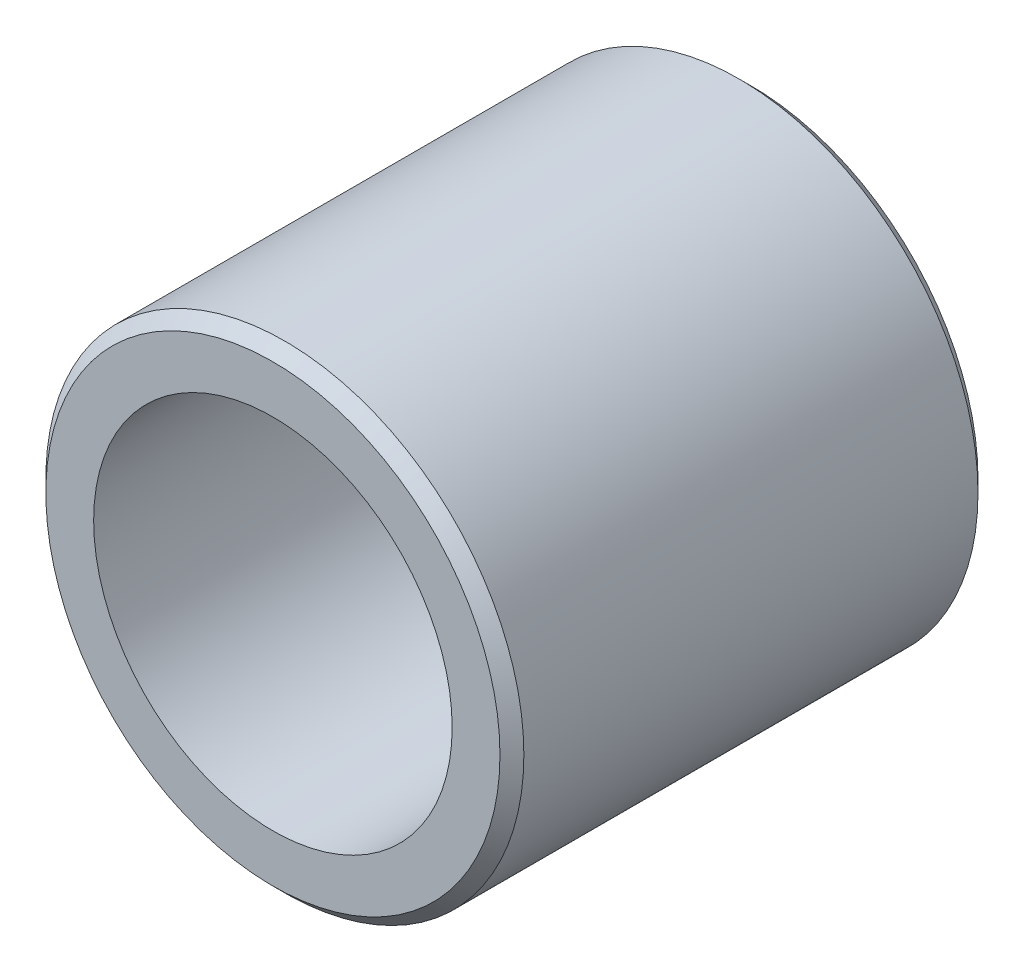
ISO-10303-21;
HEADER;
FILE_DESCRIPTION(('STEP AP214'),'2;1');
FILE_NAME('part.step','',(''),(''),'','','');
FILE_SCHEMA(('AUTOMOTIVE_DESIGN { 1 0 10303 214 1 1 1 1 }'));
ENDSEC;
DATA;
#1=APPLICATION_CONTEXT('core data for automotive mechanical design processes');
#2=APPLICATION_PROTOCOL_DEFINITION('international standard','automotive_design',2000,#1);
#3=PRODUCT_CONTEXT('',#1,'mechanical');
#4=PRODUCT('Part','Part','',(#3));
#5=PRODUCT_RELATED_PRODUCT_CATEGORY('part','',(#4));
#6=PRODUCT_DEFINITION_FORMATION('','',#4);
#7=PRODUCT_DEFINITION_CONTEXT('part definition',#1,'design');
#8=PRODUCT_DEFINITION('design','',#6,#7);
#9=PRODUCT_DEFINITION_SHAPE('','',#8);
#10=(LENGTH_UNIT() NAMED_UNIT(*) SI_UNIT(.MILLI.,.METRE.));
#11=(NAMED_UNIT(*) PLANE_ANGLE_UNIT() SI_UNIT($,.RADIAN.));
#12=(NAMED_UNIT(*) SI_UNIT($,.STERADIAN.) SOLID_ANGLE_UNIT());
#13=UNCERTAINTY_MEASURE_WITH_UNIT(LENGTH_MEASURE(1.E-05),#10,'distance_accuracy_value','');
#14=(GEOMETRIC_REPRESENTATION_CONTEXT(3) GLOBAL_UNCERTAINTY_ASSIGNED_CONTEXT((#13)) GLOBAL_UNIT_ASSIGNED_CONTEXT((#10,
#11,#12)) REPRESENTATION_CONTEXT('',''));
#15=CARTESIAN_POINT('',(0.,0.,0.));
#16=DIRECTION('',(0.,0.,1.));
#17=DIRECTION('',(1.,0.,0.));
#18=AXIS2_PLACEMENT_3D('',#15,#16,#17);
#19=CARTESIAN_POINT('',(0.,0.,50.8));
#20=DIRECTION('',(0.,0.,1.));
#21=DIRECTION('',(1.,0.,0.));
#22=AXIS2_PLACEMENT_3D('',#19,#20,#21);
#23=PLANE('',#22);
#24=CARTESIAN_POINT('',(0.,0.,50.8));
#25=DIRECTION('',(0.,0.,1.));
#26=DIRECTION('',(1.,0.,0.));
#27=AXIS2_PLACEMENT_3D('',#24,#25,#26);
#28=CIRCLE('',#27,24.13);
#29=CARTESIAN_POINT('',(24.1300000000001,0.,50.8));
#30=VERTEX_POINT('',#29);
#31=EDGE_CURVE('E49',#30,#30,#28,.T.);
#32=ORIENTED_EDGE('',*,*,#31,.T.);
#33=EDGE_LOOP('',(#32));
#34=FACE_BOUND('',#33,.T.);
#35=CARTESIAN_POINT('',(0.,0.,50.8));
#36=DIRECTION('',(0.,0.,1.));
#37=DIRECTION('',(1.,0.,0.));
#38=AXIS2_PLACEMENT_3D('',#35,#36,#37);
#39=CIRCLE('',#38,19.05);
#40=CARTESIAN_POINT('',(19.0500000000001,0.,50.8));
#41=VERTEX_POINT('',#40);
#42=EDGE_CURVE('E62',#41,#41,#39,.T.);
#43=ORIENTED_EDGE('',*,*,#42,.F.);
#44=EDGE_LOOP('',(#43));
#45=FACE_BOUND('',#44,.T.);
#46=ADVANCED_FACE('F42',(#34,#45),#23,.T.);
#47=CARTESIAN_POINT('',(0.,0.,0.));
#48=DIRECTION('',(0.,0.,1.));
#49=DIRECTION('',(1.,0.,0.));
#50=AXIS2_PLACEMENT_3D('',#47,#48,#49);
#51=PLANE('',#50);
#52=CARTESIAN_POINT('',(0.,0.,0.));
#53=DIRECTION('',(0.,0.,1.));
#54=DIRECTION('',(1.,0.,0.));
#55=AXIS2_PLACEMENT_3D('',#52,#53,#54);
#56=CIRCLE('',#55,24.13);
#57=CARTESIAN_POINT('',(24.13,0.,0.));
#58=VERTEX_POINT('',#57);
#59=EDGE_CURVE('E53',#58,#58,#56,.F.);
#60=ORIENTED_EDGE('',*,*,#59,.T.);
#61=EDGE_LOOP('',(#60));
#62=FACE_BOUND('',#61,.T.);
#63=CARTESIAN_POINT('',(0.,0.,0.));
#64=DIRECTION('',(0.,0.,1.));
#65=DIRECTION('',(1.,0.,0.));
#66=AXIS2_PLACEMENT_3D('',#63,#64,#65);
#67=CIRCLE('',#66,19.05);
#68=CARTESIAN_POINT('',(19.05,0.,0.));
#69=VERTEX_POINT('',#68);
#70=EDGE_CURVE('E63',#69,#69,#67,.T.);
#71=ORIENTED_EDGE('',*,*,#70,.T.);
#72=EDGE_LOOP('',(#71));
#73=FACE_BOUND('',#72,.T.);
#74=ADVANCED_FACE('F73',(#62,#73),#51,.F.);
#75=CARTESIAN_POINT('',(0.,0.,50.8));
#76=DIRECTION('',(0.,0.,-1.));
#77=DIRECTION('',(-1.,0.,0.));
#78=AXIS2_PLACEMENT_3D('',#75,#76,#77);
#79=CYLINDRICAL_SURFACE('',#78,25.4);
#80=CARTESIAN_POINT('',(0.,0.,49.53));
#81=DIRECTION('',(0.,0.,1.));
#82=DIRECTION('',(1.,0.,0.));
#83=AXIS2_PLACEMENT_3D('',#80,#81,#82);
#84=CIRCLE('',#83,25.4);
#85=CARTESIAN_POINT('',(25.4,0.,49.53));
#86=VERTEX_POINT('',#85);
#87=EDGE_CURVE('E12',#86,#86,#84,.F.);
#88=ORIENTED_EDGE('',*,*,#87,.T.);
#89=EDGE_LOOP('',(#88));
#90=FACE_BOUND('',#89,.T.);
#91=CARTESIAN_POINT('',(0.,0.,1.26999999999999));
#92=DIRECTION('',(0.,0.,1.));
#93=DIRECTION('',(1.,0.,0.));
#94=AXIS2_PLACEMENT_3D('',#91,#92,#93);
#95=CIRCLE('',#94,25.4);
#96=CARTESIAN_POINT('',(25.4000000000001,0.,1.26999999999999));
#97=VERTEX_POINT('',#96);
#98=EDGE_CURVE('E57',#97,#97,#95,.T.);
#99=ORIENTED_EDGE('',*,*,#98,.T.);
#100=EDGE_LOOP('',(#99));
#101=FACE_BOUND('',#100,.T.);
#102=ADVANCED_FACE('F78',(#90,#101),#79,.T.);
#103=CARTESIAN_POINT('',(0.,0.,50.8));
#104=DIRECTION('',(0.,0.,-1.));
#105=DIRECTION('',(-1.,0.,0.));
#106=AXIS2_PLACEMENT_3D('',#103,#104,#105);
#107=CYLINDRICAL_SURFACE('',#106,19.05);
#108=ORIENTED_EDGE('',*,*,#42,.T.);
#109=EDGE_LOOP('',(#108));
#110=FACE_BOUND('',#109,.T.);
#111=ORIENTED_EDGE('',*,*,#70,.F.);
#112=EDGE_LOOP('',(#111));
#113=FACE_BOUND('',#112,.T.);
#114=ADVANCED_FACE('F69',(#110,#113),#107,.F.);
#115=CARTESIAN_POINT('',(0.,0.,1.26999999999999));
#116=DIRECTION('',(0.,0.,1.));
#117=DIRECTION('',(1.,0.,0.));
#118=AXIS2_PLACEMENT_3D('',#115,#116,#117);
#119=CONICAL_SURFACE('',#118,25.4,0.78539816339745);
#120=ORIENTED_EDGE('',*,*,#59,.F.);
#121=EDGE_LOOP('',(#120));
#122=FACE_BOUND('',#121,.T.);
#123=ORIENTED_EDGE('',*,*,#98,.F.);
#124=EDGE_LOOP('',(#123));
#125=FACE_BOUND('',#124,.T.);
#126=ADVANCED_FACE('F84',(#122,#125),#119,.T.);
#127=CARTESIAN_POINT('',(0.,0.,50.8));
#128=DIRECTION('',(0.,0.,-1.));
#129=DIRECTION('',(-1.,0.,0.));
#130=AXIS2_PLACEMENT_3D('',#127,#128,#129);
#131=CONICAL_SURFACE('',#130,24.13,0.785398163397446);
#132=ORIENTED_EDGE('',*,*,#87,.F.);
#133=EDGE_LOOP('',(#132));
#134=FACE_BOUND('',#133,.T.);
#135=ORIENTED_EDGE('',*,*,#31,.F.);
#136=EDGE_LOOP('',(#135));
#137=FACE_BOUND('',#136,.T.);
#138=ADVANCED_FACE('F44',(#134,#137),#131,.T.);
#139=CLOSED_SHELL('',(#46,#74,#102,#114,#126,#138));
#140=MANIFOLD_SOLID_BREP('B2',#139);
#141=ADVANCED_BREP_SHAPE_REPRESENTATION('',(#18,#140),#14);
#142=SHAPE_DEFINITION_REPRESENTATION(#9,#141);
ENDSEC;
END-ISO-10303-21;
